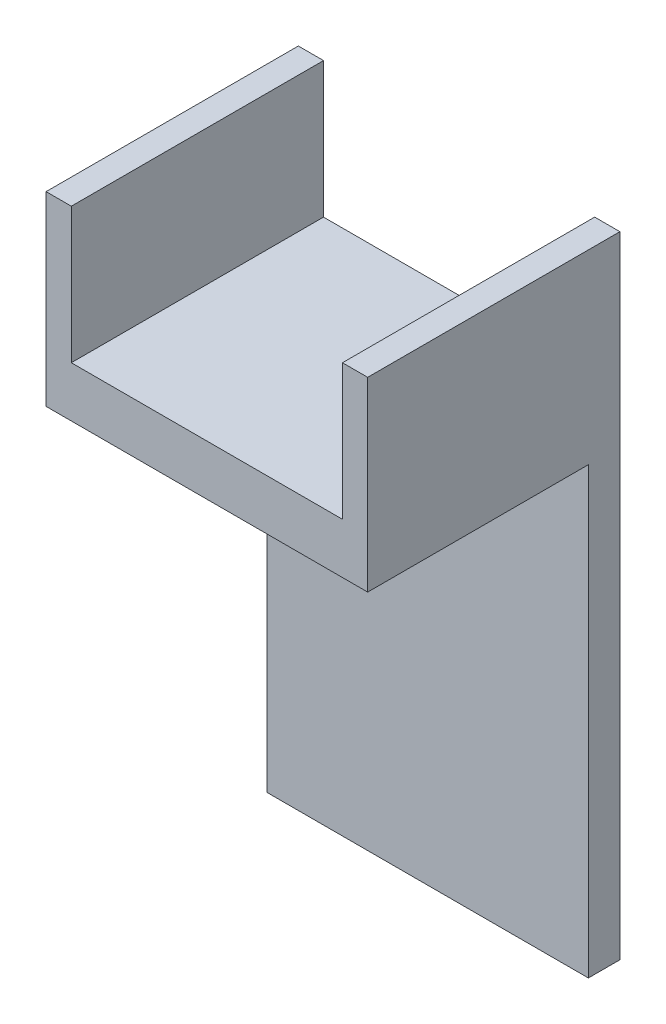
ISO-10303-21;
HEADER;
FILE_DESCRIPTION(('STEP AP214'),'2;1');
FILE_NAME('part.step','',(''),(''),'','','');
FILE_SCHEMA(('AUTOMOTIVE_DESIGN { 1 0 10303 214 1 1 1 1 }'));
ENDSEC;
DATA;
#1=APPLICATION_CONTEXT('core data for automotive mechanical design processes');
#2=APPLICATION_PROTOCOL_DEFINITION('international standard','automotive_design',2000,#1);
#3=PRODUCT_CONTEXT('',#1,'mechanical');
#4=PRODUCT('Part','Part','',(#3));
#5=PRODUCT_RELATED_PRODUCT_CATEGORY('part','',(#4));
#6=PRODUCT_DEFINITION_FORMATION('','',#4);
#7=PRODUCT_DEFINITION_CONTEXT('part definition',#1,'design');
#8=PRODUCT_DEFINITION('design','',#6,#7);
#9=PRODUCT_DEFINITION_SHAPE('','',#8);
#10=(LENGTH_UNIT() NAMED_UNIT(*) SI_UNIT(.MILLI.,.METRE.));
#11=(NAMED_UNIT(*) PLANE_ANGLE_UNIT() SI_UNIT($,.RADIAN.));
#12=(NAMED_UNIT(*) SI_UNIT($,.STERADIAN.) SOLID_ANGLE_UNIT());
#13=UNCERTAINTY_MEASURE_WITH_UNIT(LENGTH_MEASURE(1.E-05),#10,'distance_accuracy_value','');
#14=(GEOMETRIC_REPRESENTATION_CONTEXT(3) GLOBAL_UNCERTAINTY_ASSIGNED_CONTEXT((#13)) GLOBAL_UNIT_ASSIGNED_CONTEXT((#10,
#11,#12)) REPRESENTATION_CONTEXT('',''));
#15=CARTESIAN_POINT('',(0.,0.,0.));
#16=DIRECTION('',(0.,0.,1.));
#17=DIRECTION('',(1.,0.,0.));
#18=AXIS2_PLACEMENT_3D('',#15,#16,#17);
#19=CARTESIAN_POINT('',(0.,0.,5.));
#20=DIRECTION('',(0.,0.,1.));
#21=DIRECTION('',(1.,0.,0.));
#22=AXIS2_PLACEMENT_3D('',#19,#20,#21);
#23=PLANE('',#22);
#24=DIRECTION('',(0.,1.,0.));
#25=VECTOR('',#24,1.);
#26=CARTESIAN_POINT('',(-25.5,0.,5.));
#27=LINE('',#26,#25);
#28=CARTESIAN_POINT('',(-25.5,-100.,5.));
#29=VERTEX_POINT('',#28);
#30=CARTESIAN_POINT('',(-25.5,-29.5,5.));
#31=VERTEX_POINT('',#30);
#32=EDGE_CURVE('E240',#29,#31,#27,.T.);
#33=ORIENTED_EDGE('',*,*,#32,.F.);
#34=DIRECTION('',(-1.,0.,0.));
#35=VECTOR('',#34,1.);
#36=CARTESIAN_POINT('',(0.,-100.,5.));
#37=LINE('',#36,#35);
#38=CARTESIAN_POINT('',(25.5,-100.,5.));
#39=VERTEX_POINT('',#38);
#40=EDGE_CURVE('E231',#39,#29,#37,.T.);
#41=ORIENTED_EDGE('',*,*,#40,.F.);
#42=DIRECTION('',(0.,1.,0.));
#43=VECTOR('',#42,1.);
#44=CARTESIAN_POINT('',(25.5,0.,5.));
#45=LINE('',#44,#43);
#46=CARTESIAN_POINT('',(25.5,-29.5,5.));
#47=VERTEX_POINT('',#46);
#48=EDGE_CURVE('E52',#39,#47,#45,.T.);
#49=ORIENTED_EDGE('',*,*,#48,.T.);
#50=DIRECTION('',(-1.,0.,0.));
#51=VECTOR('',#50,1.);
#52=CARTESIAN_POINT('',(0.,-29.5,5.));
#53=LINE('',#52,#51);
#54=CARTESIAN_POINT('',(5.,-29.5,5.));
#55=VERTEX_POINT('',#54);
#56=EDGE_CURVE('E195',#47,#55,#53,.T.);
#57=ORIENTED_EDGE('',*,*,#56,.T.);
#58=DIRECTION('',(0.,1.,0.));
#59=VECTOR('',#58,1.);
#60=CARTESIAN_POINT('',(5.,0.,5.));
#61=LINE('',#60,#59);
#62=CARTESIAN_POINT('',(5.,-50.,5.));
#63=VERTEX_POINT('',#62);
#64=EDGE_CURVE('E60',#63,#55,#61,.T.);
#65=ORIENTED_EDGE('',*,*,#64,.F.);
#66=DIRECTION('',(1.,0.,0.));
#67=VECTOR('',#66,1.);
#68=CARTESIAN_POINT('',(0.,-50.,5.));
#69=LINE('',#68,#67);
#70=CARTESIAN_POINT('',(-5.,-50.,5.));
#71=VERTEX_POINT('',#70);
#72=EDGE_CURVE('E216',#71,#63,#69,.T.);
#73=ORIENTED_EDGE('',*,*,#72,.F.);
#74=DIRECTION('',(0.,1.,0.));
#75=VECTOR('',#74,1.);
#76=CARTESIAN_POINT('',(-5.,0.,5.));
#77=LINE('',#76,#75);
#78=CARTESIAN_POINT('',(-5.,-29.5,5.));
#79=VERTEX_POINT('',#78);
#80=EDGE_CURVE('E222',#71,#79,#77,.T.);
#81=ORIENTED_EDGE('',*,*,#80,.T.);
#82=EDGE_CURVE('E197',#79,#31,#53,.T.);
#83=ORIENTED_EDGE('',*,*,#82,.T.);
#84=EDGE_LOOP('',(#33,#41,#49,#57,#65,#73,#81,#83));
#85=FACE_BOUND('',#84,.T.);
#86=ADVANCED_FACE('F38',(#85),#23,.T.);
#87=CARTESIAN_POINT('',(0.,0.,0.));
#88=DIRECTION('',(0.,-1.,0.));
#89=DIRECTION('',(0.,0.,-1.));
#90=AXIS2_PLACEMENT_3D('',#87,#88,#89);
#91=PLANE('',#90);
#92=DIRECTION('',(0.,0.,-1.));
#93=VECTOR('',#92,1.);
#94=CARTESIAN_POINT('',(25.5,0.,40.));
#95=LINE('',#94,#93);
#96=CARTESIAN_POINT('',(25.5,0.,40.));
#97=VERTEX_POINT('',#96);
#98=CARTESIAN_POINT('',(25.5,0.,0.));
#99=VERTEX_POINT('',#98);
#100=EDGE_CURVE('E146',#97,#99,#95,.T.);
#101=ORIENTED_EDGE('',*,*,#100,.T.);
#102=DIRECTION('',(1.,0.,0.));
#103=VECTOR('',#102,1.);
#104=CARTESIAN_POINT('',(0.,0.,0.));
#105=LINE('',#104,#103);
#106=CARTESIAN_POINT('',(21.5,0.,0.));
#107=VERTEX_POINT('',#106);
#108=EDGE_CURVE('E161',#107,#99,#105,.T.);
#109=ORIENTED_EDGE('',*,*,#108,.F.);
#110=DIRECTION('',(0.,0.,1.));
#111=VECTOR('',#110,1.);
#112=CARTESIAN_POINT('',(21.5,0.,0.));
#113=LINE('',#112,#111);
#114=CARTESIAN_POINT('',(21.5,0.,40.));
#115=VERTEX_POINT('',#114);
#116=EDGE_CURVE('E163',#107,#115,#113,.T.);
#117=ORIENTED_EDGE('',*,*,#116,.T.);
#118=DIRECTION('',(-1.,0.,0.));
#119=VECTOR('',#118,1.);
#120=CARTESIAN_POINT('',(0.,0.,40.));
#121=LINE('',#120,#119);
#122=EDGE_CURVE('E205',#97,#115,#121,.T.);
#123=ORIENTED_EDGE('',*,*,#122,.F.);
#124=EDGE_LOOP('',(#101,#109,#117,#123));
#125=FACE_BOUND('',#124,.T.);
#126=ADVANCED_FACE('F277',(#125),#91,.F.);
#127=CARTESIAN_POINT('',(0.,0.,0.));
#128=DIRECTION('',(0.,0.,1.));
#129=DIRECTION('',(1.,0.,0.));
#130=AXIS2_PLACEMENT_3D('',#127,#128,#129);
#131=PLANE('',#130);
#132=DIRECTION('',(1.,0.,0.));
#133=VECTOR('',#132,1.);
#134=CARTESIAN_POINT('',(167.406690427832,-100.,0.));
#135=LINE('',#134,#133);
#136=CARTESIAN_POINT('',(-25.5,-100.,0.));
#137=VERTEX_POINT('',#136);
#138=CARTESIAN_POINT('',(25.5,-100.,0.));
#139=VERTEX_POINT('',#138);
#140=EDGE_CURVE('E155',#137,#139,#135,.T.);
#141=ORIENTED_EDGE('',*,*,#140,.F.);
#142=DIRECTION('',(0.,-1.,0.));
#143=VECTOR('',#142,1.);
#144=CARTESIAN_POINT('',(-25.5,0.,0.));
#145=LINE('',#144,#143);
#146=CARTESIAN_POINT('',(-25.5,0.,0.));
#147=VERTEX_POINT('',#146);
#148=EDGE_CURVE('E138',#147,#137,#145,.T.);
#149=ORIENTED_EDGE('',*,*,#148,.F.);
#150=CARTESIAN_POINT('',(-21.5,0.,0.));
#151=VERTEX_POINT('',#150);
#152=EDGE_CURVE('E152',#147,#151,#105,.T.);
#153=ORIENTED_EDGE('',*,*,#152,.T.);
#154=DIRECTION('',(0.,-1.,0.));
#155=VECTOR('',#154,1.);
#156=CARTESIAN_POINT('',(-21.5,0.,0.));
#157=LINE('',#156,#155);
#158=CARTESIAN_POINT('',(-21.5,-21.5,0.));
#159=VERTEX_POINT('',#158);
#160=EDGE_CURVE('E173',#151,#159,#157,.T.);
#161=ORIENTED_EDGE('',*,*,#160,.T.);
#162=DIRECTION('',(1.,0.,0.));
#163=VECTOR('',#162,1.);
#164=CARTESIAN_POINT('',(0.,-21.5,0.));
#165=LINE('',#164,#163);
#166=CARTESIAN_POINT('',(21.5,-21.5,0.));
#167=VERTEX_POINT('',#166);
#168=EDGE_CURVE('E46',#159,#167,#165,.T.);
#169=ORIENTED_EDGE('',*,*,#168,.T.);
#170=DIRECTION('',(0.,1.,0.));
#171=VECTOR('',#170,1.);
#172=CARTESIAN_POINT('',(21.5,0.,0.));
#173=LINE('',#172,#171);
#174=EDGE_CURVE('E166',#167,#107,#173,.T.);
#175=ORIENTED_EDGE('',*,*,#174,.T.);
#176=ORIENTED_EDGE('',*,*,#108,.T.);
#177=DIRECTION('',(0.,-1.,0.));
#178=VECTOR('',#177,1.);
#179=CARTESIAN_POINT('',(25.5,0.,0.));
#180=LINE('',#179,#178);
#181=EDGE_CURVE('E238',#99,#139,#180,.T.);
#182=ORIENTED_EDGE('',*,*,#181,.T.);
#183=EDGE_LOOP('',(#141,#149,#153,#161,#169,#175,#176,#182));
#184=FACE_BOUND('',#183,.T.);
#185=ADVANCED_FACE('F40',(#184),#131,.F.);
#186=CARTESIAN_POINT('',(167.406690427832,-100.,35.));
#187=DIRECTION('',(0.,1.,0.));
#188=DIRECTION('',(-1.,0.,0.));
#189=AXIS2_PLACEMENT_3D('',#186,#187,#188);
#190=PLANE('',#189);
#191=ORIENTED_EDGE('',*,*,#40,.T.);
#192=DIRECTION('',(0.,0.,-1.));
#193=VECTOR('',#192,1.);
#194=CARTESIAN_POINT('',(-25.5,-100.,10.));
#195=LINE('',#194,#193);
#196=EDGE_CURVE('E156',#29,#137,#195,.T.);
#197=ORIENTED_EDGE('',*,*,#196,.T.);
#198=ORIENTED_EDGE('',*,*,#140,.T.);
#199=DIRECTION('',(0.,0.,-1.));
#200=VECTOR('',#199,1.);
#201=CARTESIAN_POINT('',(25.5,-100.,35.));
#202=LINE('',#201,#200);
#203=EDGE_CURVE('E11',#39,#139,#202,.T.);
#204=ORIENTED_EDGE('',*,*,#203,.F.);
#205=EDGE_LOOP('',(#191,#197,#198,#204));
#206=FACE_BOUND('',#205,.T.);
#207=ADVANCED_FACE('F243',(#206),#190,.F.);
#208=CARTESIAN_POINT('',(0.,-29.5,40.));
#209=DIRECTION('',(0.,-1.,0.));
#210=DIRECTION('',(0.,0.,-1.));
#211=AXIS2_PLACEMENT_3D('',#208,#209,#210);
#212=PLANE('',#211);
#213=ORIENTED_EDGE('',*,*,#82,.F.);
#214=DIRECTION('',(0.,0.,1.));
#215=VECTOR('',#214,1.);
#216=CARTESIAN_POINT('',(-5.,-29.5,40.));
#217=LINE('',#216,#215);
#218=CARTESIAN_POINT('',(-5.,-29.5,40.));
#219=VERTEX_POINT('',#218);
#220=EDGE_CURVE('E224',#79,#219,#217,.T.);
#221=ORIENTED_EDGE('',*,*,#220,.T.);
#222=DIRECTION('',(-1.,0.,0.));
#223=VECTOR('',#222,1.);
#224=CARTESIAN_POINT('',(0.,-29.5,40.));
#225=LINE('',#224,#223);
#226=CARTESIAN_POINT('',(-25.5,-29.5,40.));
#227=VERTEX_POINT('',#226);
#228=EDGE_CURVE('E214',#219,#227,#225,.T.);
#229=ORIENTED_EDGE('',*,*,#228,.T.);
#230=DIRECTION('',(0.,0.,-1.));
#231=VECTOR('',#230,1.);
#232=CARTESIAN_POINT('',(-25.5,-29.5,40.));
#233=LINE('',#232,#231);
#234=EDGE_CURVE('E188',#227,#31,#233,.T.);
#235=ORIENTED_EDGE('',*,*,#234,.T.);
#236=EDGE_LOOP('',(#213,#221,#229,#235));
#237=FACE_BOUND('',#236,.T.);
#238=ADVANCED_FACE('F251',(#237),#212,.T.);
#239=ORIENTED_EDGE('',*,*,#152,.F.);
#240=DIRECTION('',(0.,0.,-1.));
#241=VECTOR('',#240,1.);
#242=CARTESIAN_POINT('',(-25.5,0.,40.));
#243=LINE('',#242,#241);
#244=CARTESIAN_POINT('',(-25.5,0.,40.));
#245=VERTEX_POINT('',#244);
#246=EDGE_CURVE('E134',#245,#147,#243,.T.);
#247=ORIENTED_EDGE('',*,*,#246,.F.);
#248=DIRECTION('',(-1.,0.,0.));
#249=VECTOR('',#248,1.);
#250=CARTESIAN_POINT('',(0.,0.,40.));
#251=LINE('',#250,#249);
#252=CARTESIAN_POINT('',(-21.5,0.,40.));
#253=VERTEX_POINT('',#252);
#254=EDGE_CURVE('E147',#253,#245,#251,.T.);
#255=ORIENTED_EDGE('',*,*,#254,.F.);
#256=DIRECTION('',(0.,0.,-1.));
#257=VECTOR('',#256,1.);
#258=CARTESIAN_POINT('',(-21.5,0.,0.));
#259=LINE('',#258,#257);
#260=EDGE_CURVE('E160',#253,#151,#259,.T.);
#261=ORIENTED_EDGE('',*,*,#260,.T.);
#262=EDGE_LOOP('',(#239,#247,#255,#261));
#263=FACE_BOUND('',#262,.T.);
#264=ADVANCED_FACE('F159',(#263),#91,.F.);
#265=CARTESIAN_POINT('',(21.5,-21.5,-47.));
#266=DIRECTION('',(0.,-1.,0.));
#267=DIRECTION('',(0.,0.,-1.));
#268=AXIS2_PLACEMENT_3D('',#265,#266,#267);
#269=PLANE('',#268);
#270=DIRECTION('',(0.,0.,1.));
#271=VECTOR('',#270,1.);
#272=CARTESIAN_POINT('',(21.5,-21.5,-47.));
#273=LINE('',#272,#271);
#274=CARTESIAN_POINT('',(21.5,-21.5,40.));
#275=VERTEX_POINT('',#274);
#276=EDGE_CURVE('E181',#167,#275,#273,.T.);
#277=ORIENTED_EDGE('',*,*,#276,.F.);
#278=ORIENTED_EDGE('',*,*,#168,.F.);
#279=DIRECTION('',(0.,0.,1.));
#280=VECTOR('',#279,1.);
#281=CARTESIAN_POINT('',(-21.5,-21.5,-47.));
#282=LINE('',#281,#280);
#283=CARTESIAN_POINT('',(-21.5,-21.5,40.));
#284=VERTEX_POINT('',#283);
#285=EDGE_CURVE('E186',#159,#284,#282,.T.);
#286=ORIENTED_EDGE('',*,*,#285,.T.);
#287=DIRECTION('',(-1.,0.,0.));
#288=VECTOR('',#287,1.);
#289=CARTESIAN_POINT('',(0.,-21.5,40.));
#290=LINE('',#289,#288);
#291=EDGE_CURVE('E185',#275,#284,#290,.T.);
#292=ORIENTED_EDGE('',*,*,#291,.F.);
#293=EDGE_LOOP('',(#277,#278,#286,#292));
#294=FACE_BOUND('',#293,.T.);
#295=ADVANCED_FACE('F184',(#294),#269,.F.);
#296=CARTESIAN_POINT('',(21.5,0.,-47.));
#297=DIRECTION('',(1.,0.,0.));
#298=DIRECTION('',(0.,0.,-1.));
#299=AXIS2_PLACEMENT_3D('',#296,#297,#298);
#300=PLANE('',#299);
#301=ORIENTED_EDGE('',*,*,#276,.T.);
#302=DIRECTION('',(0.,-1.,0.));
#303=VECTOR('',#302,1.);
#304=CARTESIAN_POINT('',(21.5,0.,40.));
#305=LINE('',#304,#303);
#306=EDGE_CURVE('E203',#115,#275,#305,.T.);
#307=ORIENTED_EDGE('',*,*,#306,.F.);
#308=ORIENTED_EDGE('',*,*,#116,.F.);
#309=ORIENTED_EDGE('',*,*,#174,.F.);
#310=EDGE_LOOP('',(#301,#307,#308,#309));
#311=FACE_BOUND('',#310,.T.);
#312=ADVANCED_FACE('F179',(#311),#300,.F.);
#313=CARTESIAN_POINT('',(-21.5,0.,-47.));
#314=DIRECTION('',(-1.,0.,0.));
#315=DIRECTION('',(0.,-1.,0.));
#316=AXIS2_PLACEMENT_3D('',#313,#314,#315);
#317=PLANE('',#316);
#318=ORIENTED_EDGE('',*,*,#260,.F.);
#319=DIRECTION('',(0.,1.,0.));
#320=VECTOR('',#319,1.);
#321=CARTESIAN_POINT('',(-21.5,0.,40.));
#322=LINE('',#321,#320);
#323=EDGE_CURVE('E199',#284,#253,#322,.T.);
#324=ORIENTED_EDGE('',*,*,#323,.F.);
#325=ORIENTED_EDGE('',*,*,#285,.F.);
#326=ORIENTED_EDGE('',*,*,#160,.F.);
#327=EDGE_LOOP('',(#318,#324,#325,#326));
#328=FACE_BOUND('',#327,.T.);
#329=ADVANCED_FACE('F264',(#328),#317,.F.);
#330=CARTESIAN_POINT('',(-25.5,0.,40.));
#331=DIRECTION('',(-1.,0.,0.));
#332=DIRECTION('',(0.,0.,1.));
#333=AXIS2_PLACEMENT_3D('',#330,#331,#332);
#334=PLANE('',#333);
#335=ORIENTED_EDGE('',*,*,#32,.T.);
#336=ORIENTED_EDGE('',*,*,#234,.F.);
#337=DIRECTION('',(0.,1.,0.));
#338=VECTOR('',#337,1.);
#339=CARTESIAN_POINT('',(-25.5,0.,40.));
#340=LINE('',#339,#338);
#341=EDGE_CURVE('E142',#227,#245,#340,.T.);
#342=ORIENTED_EDGE('',*,*,#341,.T.);
#343=ORIENTED_EDGE('',*,*,#246,.T.);
#344=ORIENTED_EDGE('',*,*,#148,.T.);
#345=ORIENTED_EDGE('',*,*,#196,.F.);
#346=EDGE_LOOP('',(#335,#336,#342,#343,#344,#345));
#347=FACE_BOUND('',#346,.T.);
#348=ADVANCED_FACE('F137',(#347),#334,.T.);
#349=DIRECTION('',(0.,0.,1.));
#350=VECTOR('',#349,1.);
#351=CARTESIAN_POINT('',(5.,-29.5,40.));
#352=LINE('',#351,#350);
#353=CARTESIAN_POINT('',(5.,-29.5,40.));
#354=VERTEX_POINT('',#353);
#355=EDGE_CURVE('E219',#55,#354,#352,.T.);
#356=ORIENTED_EDGE('',*,*,#355,.F.);
#357=ORIENTED_EDGE('',*,*,#56,.F.);
#358=DIRECTION('',(0.,0.,-1.));
#359=VECTOR('',#358,1.);
#360=CARTESIAN_POINT('',(25.5,-29.5,40.));
#361=LINE('',#360,#359);
#362=CARTESIAN_POINT('',(25.5,-29.5,40.));
#363=VERTEX_POINT('',#362);
#364=EDGE_CURVE('E192',#363,#47,#361,.T.);
#365=ORIENTED_EDGE('',*,*,#364,.F.);
#366=EDGE_CURVE('E210',#363,#354,#225,.T.);
#367=ORIENTED_EDGE('',*,*,#366,.T.);
#368=EDGE_LOOP('',(#356,#357,#365,#367));
#369=FACE_BOUND('',#368,.T.);
#370=ADVANCED_FACE('F271',(#369),#212,.T.);
#371=CARTESIAN_POINT('',(25.5,0.,40.));
#372=DIRECTION('',(-1.,0.,0.));
#373=DIRECTION('',(0.,0.,1.));
#374=AXIS2_PLACEMENT_3D('',#371,#372,#373);
#375=PLANE('',#374);
#376=ORIENTED_EDGE('',*,*,#181,.F.);
#377=ORIENTED_EDGE('',*,*,#100,.F.);
#378=DIRECTION('',(0.,1.,0.));
#379=VECTOR('',#378,1.);
#380=CARTESIAN_POINT('',(25.5,0.,40.));
#381=LINE('',#380,#379);
#382=EDGE_CURVE('E208',#363,#97,#381,.T.);
#383=ORIENTED_EDGE('',*,*,#382,.F.);
#384=ORIENTED_EDGE('',*,*,#364,.T.);
#385=ORIENTED_EDGE('',*,*,#48,.F.);
#386=ORIENTED_EDGE('',*,*,#203,.T.);
#387=EDGE_LOOP('',(#376,#377,#383,#384,#385,#386));
#388=FACE_BOUND('',#387,.T.);
#389=ADVANCED_FACE('F294',(#388),#375,.F.);
#390=CARTESIAN_POINT('',(0.,0.,40.));
#391=DIRECTION('',(0.,0.,1.));
#392=DIRECTION('',(1.,0.,0.));
#393=AXIS2_PLACEMENT_3D('',#390,#391,#392);
#394=PLANE('',#393);
#395=ORIENTED_EDGE('',*,*,#291,.T.);
#396=ORIENTED_EDGE('',*,*,#323,.T.);
#397=ORIENTED_EDGE('',*,*,#254,.T.);
#398=ORIENTED_EDGE('',*,*,#341,.F.);
#399=ORIENTED_EDGE('',*,*,#228,.F.);
#400=EDGE_CURVE('E213',#354,#219,#225,.T.);
#401=ORIENTED_EDGE('',*,*,#400,.F.);
#402=ORIENTED_EDGE('',*,*,#366,.F.);
#403=ORIENTED_EDGE('',*,*,#382,.T.);
#404=ORIENTED_EDGE('',*,*,#122,.T.);
#405=ORIENTED_EDGE('',*,*,#306,.T.);
#406=EDGE_LOOP('',(#395,#396,#397,#398,#399,#401,#402,#403,#404,#405));
#407=FACE_BOUND('',#406,.T.);
#408=ADVANCED_FACE('F261',(#407),#394,.T.);
#409=CARTESIAN_POINT('',(0.,-29.5,40.));
#410=DIRECTION('',(0.,-0.862883361109251,0.505403111506847));
#411=DIRECTION('',(0.,-0.505403111506847,-0.862883361109251));
#412=AXIS2_PLACEMENT_3D('',#409,#410,#411);
#413=PLANE('',#412);
#414=DIRECTION('',(0.,-0.505403111506847,-0.862883361109251));
#415=VECTOR('',#414,1.);
#416=CARTESIAN_POINT('',(-5.,-29.5,40.));
#417=LINE('',#416,#415);
#418=EDGE_CURVE('E228',#219,#71,#417,.T.);
#419=ORIENTED_EDGE('',*,*,#418,.T.);
#420=ORIENTED_EDGE('',*,*,#72,.T.);
#421=DIRECTION('',(0.,-0.505403111506847,-0.862883361109251));
#422=VECTOR('',#421,1.);
#423=CARTESIAN_POINT('',(5.,-29.5,40.));
#424=LINE('',#423,#422);
#425=EDGE_CURVE('E227',#354,#63,#424,.T.);
#426=ORIENTED_EDGE('',*,*,#425,.F.);
#427=ORIENTED_EDGE('',*,*,#400,.T.);
#428=EDGE_LOOP('',(#419,#420,#426,#427));
#429=FACE_BOUND('',#428,.T.);
#430=ADVANCED_FACE('F257',(#429),#413,.T.);
#431=CARTESIAN_POINT('',(5.,-97.5,20.));
#432=DIRECTION('',(1.,0.,0.));
#433=DIRECTION('',(0.,0.,-1.));
#434=AXIS2_PLACEMENT_3D('',#431,#432,#433);
#435=PLANE('',#434);
#436=ORIENTED_EDGE('',*,*,#425,.T.);
#437=ORIENTED_EDGE('',*,*,#64,.T.);
#438=ORIENTED_EDGE('',*,*,#355,.T.);
#439=EDGE_LOOP('',(#436,#437,#438));
#440=FACE_BOUND('',#439,.T.);
#441=ADVANCED_FACE('F301',(#440),#435,.T.);
#442=CARTESIAN_POINT('',(-5.,-97.5,20.));
#443=DIRECTION('',(1.,0.,0.));
#444=DIRECTION('',(0.,0.,-1.));
#445=AXIS2_PLACEMENT_3D('',#442,#443,#444);
#446=PLANE('',#445);
#447=ORIENTED_EDGE('',*,*,#80,.F.);
#448=ORIENTED_EDGE('',*,*,#418,.F.);
#449=ORIENTED_EDGE('',*,*,#220,.F.);
#450=EDGE_LOOP('',(#447,#448,#449));
#451=FACE_BOUND('',#450,.T.);
#452=ADVANCED_FACE('F255',(#451),#446,.F.);
#453=CLOSED_SHELL('',(#86,#126,#185,#207,#238,#264,#295,#312,#329,#348,#370,#389,#408,#430,#441,#452));
#454=MANIFOLD_SOLID_BREP('B2',#453);
#455=ADVANCED_BREP_SHAPE_REPRESENTATION('',(#18,#454),#14);
#456=SHAPE_DEFINITION_REPRESENTATION(#9,#455);
ENDSEC;
END-ISO-10303-21;
